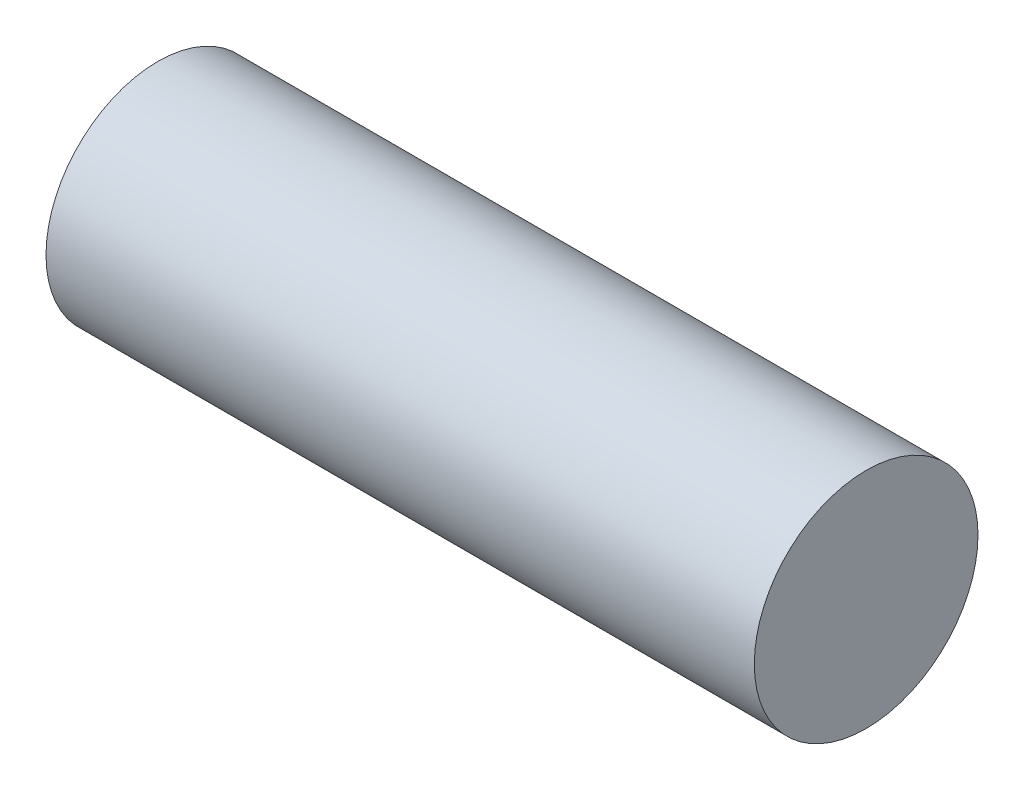
ISO-10303-21;
HEADER;
FILE_DESCRIPTION(('STEP AP214'),'2;1');
FILE_NAME('part.step','',(''),(''),'','','');
FILE_SCHEMA(('AUTOMOTIVE_DESIGN { 1 0 10303 214 1 1 1 1 }'));
ENDSEC;
DATA;
#1=APPLICATION_CONTEXT('core data for automotive mechanical design processes');
#2=APPLICATION_PROTOCOL_DEFINITION('international standard','automotive_design',2000,#1);
#3=PRODUCT_CONTEXT('',#1,'mechanical');
#4=PRODUCT('Part','Part','',(#3));
#5=PRODUCT_RELATED_PRODUCT_CATEGORY('part','',(#4));
#6=PRODUCT_DEFINITION_FORMATION('','',#4);
#7=PRODUCT_DEFINITION_CONTEXT('part definition',#1,'design');
#8=PRODUCT_DEFINITION('design','',#6,#7);
#9=PRODUCT_DEFINITION_SHAPE('','',#8);
#10=(LENGTH_UNIT() NAMED_UNIT(*) SI_UNIT(.MILLI.,.METRE.));
#11=(NAMED_UNIT(*) PLANE_ANGLE_UNIT() SI_UNIT($,.RADIAN.));
#12=(NAMED_UNIT(*) SI_UNIT($,.STERADIAN.) SOLID_ANGLE_UNIT());
#13=UNCERTAINTY_MEASURE_WITH_UNIT(LENGTH_MEASURE(1.E-05),#10,'distance_accuracy_value','');
#14=(GEOMETRIC_REPRESENTATION_CONTEXT(3) GLOBAL_UNCERTAINTY_ASSIGNED_CONTEXT((#13)) GLOBAL_UNIT_ASSIGNED_CONTEXT((#10,
#11,#12)) REPRESENTATION_CONTEXT('',''));
#15=CARTESIAN_POINT('',(0.,0.,0.));
#16=DIRECTION('',(0.,0.,1.));
#17=DIRECTION('',(1.,0.,0.));
#18=AXIS2_PLACEMENT_3D('',#15,#16,#17);
#19=CARTESIAN_POINT('',(0.,0.,0.));
#20=DIRECTION('',(1.,0.,0.));
#21=DIRECTION('',(0.,0.,-1.));
#22=AXIS2_PLACEMENT_3D('',#19,#20,#21);
#23=PLANE('',#22);
#24=CARTESIAN_POINT('',(0.,0.,0.));
#25=DIRECTION('',(-1.,0.,0.));
#26=DIRECTION('',(0.,0.,1.));
#27=AXIS2_PLACEMENT_3D('',#24,#25,#26);
#28=CIRCLE('',#27,9.);
#29=CARTESIAN_POINT('',(0.,0.,9.));
#30=VERTEX_POINT('',#29);
#31=EDGE_CURVE('E10',#30,#30,#28,.T.);
#32=ORIENTED_EDGE('',*,*,#31,.T.);
#33=EDGE_LOOP('',(#32));
#34=FACE_BOUND('',#33,.T.);
#35=ADVANCED_FACE('F43',(#34),#23,.F.);
#36=CARTESIAN_POINT('',(0.,0.,0.));
#37=DIRECTION('',(-1.,0.,0.));
#38=DIRECTION('',(0.,0.,1.));
#39=AXIS2_PLACEMENT_3D('',#36,#37,#38);
#40=CYLINDRICAL_SURFACE('',#39,9.);
#41=ORIENTED_EDGE('',*,*,#31,.F.);
#42=EDGE_LOOP('',(#41));
#43=FACE_BOUND('',#42,.T.);
#44=CARTESIAN_POINT('',(57.,0.,0.));
#45=DIRECTION('',(-1.,0.,0.));
#46=DIRECTION('',(0.,0.,1.));
#47=AXIS2_PLACEMENT_3D('',#44,#45,#46);
#48=CIRCLE('',#47,9.);
#49=CARTESIAN_POINT('',(57.,0.,9.));
#50=VERTEX_POINT('',#49);
#51=EDGE_CURVE('E50',#50,#50,#48,.T.);
#52=ORIENTED_EDGE('',*,*,#51,.T.);
#53=EDGE_LOOP('',(#52));
#54=FACE_BOUND('',#53,.T.);
#55=ADVANCED_FACE('F57',(#43,#54),#40,.T.);
#56=CARTESIAN_POINT('',(57.,9.,0.));
#57=DIRECTION('',(-1.,0.,0.));
#58=DIRECTION('',(0.,0.,1.));
#59=AXIS2_PLACEMENT_3D('',#56,#57,#58);
#60=PLANE('',#59);
#61=ORIENTED_EDGE('',*,*,#51,.F.);
#62=EDGE_LOOP('',(#61));
#63=FACE_BOUND('',#62,.T.);
#64=ADVANCED_FACE('F59',(#63),#60,.F.);
#65=CLOSED_SHELL('',(#35,#55,#64));
#66=MANIFOLD_SOLID_BREP('B2',#65);
#67=ADVANCED_BREP_SHAPE_REPRESENTATION('',(#18,#66),#14);
#68=SHAPE_DEFINITION_REPRESENTATION(#9,#67);
ENDSEC;
END-ISO-10303-21;
